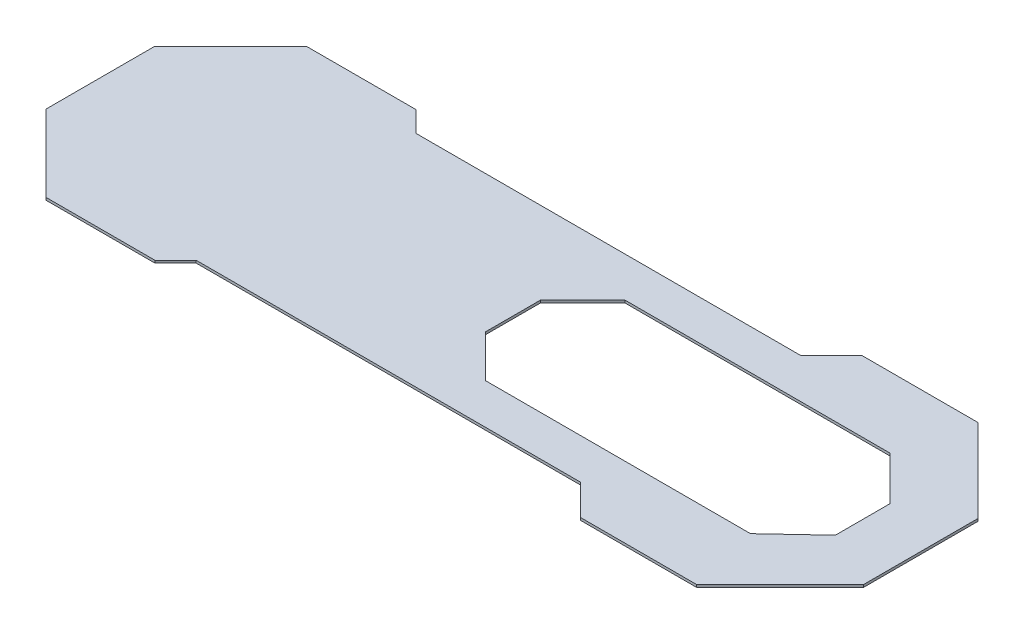
ISO-10303-21;
HEADER;
FILE_DESCRIPTION(('STEP AP214'),'2;1');
FILE_NAME('part.step','',(''),(''),'','','');
FILE_SCHEMA(('AUTOMOTIVE_DESIGN { 1 0 10303 214 1 1 1 1 }'));
ENDSEC;
DATA;
#1=APPLICATION_CONTEXT('core data for automotive mechanical design processes');
#2=APPLICATION_PROTOCOL_DEFINITION('international standard','automotive_design',2000,#1);
#3=PRODUCT_CONTEXT('',#1,'mechanical');
#4=PRODUCT('Part','Part','',(#3));
#5=PRODUCT_RELATED_PRODUCT_CATEGORY('part','',(#4));
#6=PRODUCT_DEFINITION_FORMATION('','',#4);
#7=PRODUCT_DEFINITION_CONTEXT('part definition',#1,'design');
#8=PRODUCT_DEFINITION('design','',#6,#7);
#9=PRODUCT_DEFINITION_SHAPE('','',#8);
#10=(LENGTH_UNIT() NAMED_UNIT(*) SI_UNIT(.MILLI.,.METRE.));
#11=(NAMED_UNIT(*) PLANE_ANGLE_UNIT() SI_UNIT($,.RADIAN.));
#12=(NAMED_UNIT(*) SI_UNIT($,.STERADIAN.) SOLID_ANGLE_UNIT());
#13=UNCERTAINTY_MEASURE_WITH_UNIT(LENGTH_MEASURE(1.E-05),#10,'distance_accuracy_value','');
#14=(GEOMETRIC_REPRESENTATION_CONTEXT(3) GLOBAL_UNCERTAINTY_ASSIGNED_CONTEXT((#13)) GLOBAL_UNIT_ASSIGNED_CONTEXT((#10,
#11,#12)) REPRESENTATION_CONTEXT('',''));
#15=CARTESIAN_POINT('',(0.,0.,0.));
#16=DIRECTION('',(0.,0.,1.));
#17=DIRECTION('',(1.,0.,0.));
#18=AXIS2_PLACEMENT_3D('',#15,#16,#17);
#19=CARTESIAN_POINT('',(-220.864567845436,-1.,153.389640506113));
#20=DIRECTION('',(0.707106781186546,0.,-0.707106781186549));
#21=DIRECTION('',(-0.707106781186549,0.,-0.707106781186546));
#22=AXIS2_PLACEMENT_3D('',#19,#20,#21);
#23=PLANE('',#22);
#24=DIRECTION('',(0.,-1.,0.));
#25=VECTOR('',#24,1.);
#26=CARTESIAN_POINT('',(-220.614567845437,-1.,153.639640506113));
#27=LINE('',#26,#25);
#28=CARTESIAN_POINT('',(-220.614567845436,0.,153.639640506113));
#29=VERTEX_POINT('',#28);
#30=CARTESIAN_POINT('',(-220.614567845436,-1.,153.639640506113));
#31=VERTEX_POINT('',#30);
#32=EDGE_CURVE('E268',#29,#31,#27,.T.);
#33=ORIENTED_EDGE('',*,*,#32,.F.);
#34=DIRECTION('',(-0.707106781186549,0.,-0.707106781186546));
#35=VECTOR('',#34,1.);
#36=CARTESIAN_POINT('',(-220.864567845436,0.,153.389640506113));
#37=LINE('',#36,#35);
#38=CARTESIAN_POINT('',(-212.364567845436,0.,161.889640506113));
#39=VERTEX_POINT('',#38);
#40=EDGE_CURVE('E349',#39,#29,#37,.T.);
#41=ORIENTED_EDGE('',*,*,#40,.F.);
#42=DIRECTION('',(0.,1.,0.));
#43=VECTOR('',#42,1.);
#44=CARTESIAN_POINT('',(-212.364567845436,-1.,161.889640506113));
#45=LINE('',#44,#43);
#46=CARTESIAN_POINT('',(-212.364567845436,-1.,161.889640506113));
#47=VERTEX_POINT('',#46);
#48=EDGE_CURVE('E378',#47,#39,#45,.T.);
#49=ORIENTED_EDGE('',*,*,#48,.F.);
#50=DIRECTION('',(-0.707106781186549,0.,-0.707106781186546));
#51=VECTOR('',#50,1.);
#52=CARTESIAN_POINT('',(-220.864567845436,-1.,153.389640506113));
#53=LINE('',#52,#51);
#54=EDGE_CURVE('E360',#47,#31,#53,.T.);
#55=ORIENTED_EDGE('',*,*,#54,.T.);
#56=EDGE_LOOP('',(#33,#41,#49,#55));
#57=FACE_BOUND('',#56,.T.);
#58=ADVANCED_FACE('F35',(#57),#23,.T.);
#59=CARTESIAN_POINT('',(-58.5138461441047,-1.,161.889640506113));
#60=DIRECTION('',(0.,0.,-1.));
#61=DIRECTION('',(-1.,0.,0.));
#62=AXIS2_PLACEMENT_3D('',#59,#60,#61);
#63=PLANE('',#62);
#64=DIRECTION('',(-1.,0.,0.));
#65=VECTOR('',#64,1.);
#66=CARTESIAN_POINT('',(-58.5138461441047,0.,161.889640506113));
#67=LINE('',#66,#65);
#68=CARTESIAN_POINT('',(-58.5138461441047,0.,161.889640506113));
#69=VERTEX_POINT('',#68);
#70=EDGE_CURVE('E373',#69,#39,#67,.T.);
#71=ORIENTED_EDGE('',*,*,#70,.F.);
#72=DIRECTION('',(0.,1.,0.));
#73=VECTOR('',#72,1.);
#74=CARTESIAN_POINT('',(-58.5138461441047,-1.,161.889640506113));
#75=LINE('',#74,#73);
#76=CARTESIAN_POINT('',(-58.5138461441047,-1.,161.889640506113));
#77=VERTEX_POINT('',#76);
#78=EDGE_CURVE('E380',#77,#69,#75,.T.);
#79=ORIENTED_EDGE('',*,*,#78,.F.);
#80=DIRECTION('',(-1.,0.,0.));
#81=VECTOR('',#80,1.);
#82=CARTESIAN_POINT('',(-58.5138461441047,-1.,161.889640506113));
#83=LINE('',#82,#81);
#84=EDGE_CURVE('E357',#77,#47,#83,.T.);
#85=ORIENTED_EDGE('',*,*,#84,.T.);
#86=ORIENTED_EDGE('',*,*,#48,.T.);
#87=EDGE_LOOP('',(#71,#79,#85,#86));
#88=FACE_BOUND('',#87,.T.);
#89=ADVANCED_FACE('F430',(#88),#63,.T.);
#90=CARTESIAN_POINT('',(-46.0138461441042,-1.,149.389640506113));
#91=DIRECTION('',(-0.707106781186542,0.,-0.707106781186553));
#92=DIRECTION('',(-0.707106781186553,0.,0.707106781186542));
#93=AXIS2_PLACEMENT_3D('',#90,#91,#92);
#94=PLANE('',#93);
#95=DIRECTION('',(0.,1.,0.));
#96=VECTOR('',#95,1.);
#97=CARTESIAN_POINT('',(-46.2638461441039,-1.,149.639640506113));
#98=LINE('',#97,#96);
#99=CARTESIAN_POINT('',(-46.2638461441039,-1.,149.639640506113));
#100=VERTEX_POINT('',#99);
#101=CARTESIAN_POINT('',(-46.2638461441039,0.,149.639640506113));
#102=VERTEX_POINT('',#101);
#103=EDGE_CURVE('E49',#100,#102,#98,.T.);
#104=ORIENTED_EDGE('',*,*,#103,.F.);
#105=DIRECTION('',(-0.707106781186553,0.,0.707106781186542));
#106=VECTOR('',#105,1.);
#107=CARTESIAN_POINT('',(-46.0138461441042,-1.,149.389640506113));
#108=LINE('',#107,#106);
#109=EDGE_CURVE('E355',#100,#77,#108,.T.);
#110=ORIENTED_EDGE('',*,*,#109,.T.);
#111=ORIENTED_EDGE('',*,*,#78,.T.);
#112=DIRECTION('',(-0.707106781186553,0.,0.707106781186542));
#113=VECTOR('',#112,1.);
#114=CARTESIAN_POINT('',(-46.0138461441042,0.,149.389640506113));
#115=LINE('',#114,#113);
#116=EDGE_CURVE('E371',#102,#69,#115,.T.);
#117=ORIENTED_EDGE('',*,*,#116,.F.);
#118=EDGE_LOOP('',(#104,#110,#111,#117));
#119=FACE_BOUND('',#118,.T.);
#120=ADVANCED_FACE('F424',(#119),#94,.T.);
#121=CARTESIAN_POINT('',(-46.0138461441041,-1.,262.389640506112));
#122=DIRECTION('',(-0.707106781186546,0.,0.707106781186549));
#123=DIRECTION('',(0.707106781186549,0.,0.707106781186546));
#124=AXIS2_PLACEMENT_3D('',#121,#122,#123);
#125=PLANE('',#124);
#126=DIRECTION('',(0.,-1.,0.));
#127=VECTOR('',#126,1.);
#128=CARTESIAN_POINT('',(-46.2638461441041,-1.,262.139640506112));
#129=LINE('',#128,#127);
#130=CARTESIAN_POINT('',(-46.2638461441041,0.,262.139640506112));
#131=VERTEX_POINT('',#130);
#132=CARTESIAN_POINT('',(-46.2638461441041,-1.,262.139640506112));
#133=VERTEX_POINT('',#132);
#134=EDGE_CURVE('E243',#131,#133,#129,.T.);
#135=ORIENTED_EDGE('',*,*,#134,.F.);
#136=DIRECTION('',(0.707106781186549,0.,0.707106781186546));
#137=VECTOR('',#136,1.);
#138=CARTESIAN_POINT('',(-46.0138461441041,0.,262.389640506112));
#139=LINE('',#138,#137);
#140=CARTESIAN_POINT('',(-58.513846144104,0.,249.889640506113));
#141=VERTEX_POINT('',#140);
#142=EDGE_CURVE('E368',#141,#131,#139,.T.);
#143=ORIENTED_EDGE('',*,*,#142,.F.);
#144=DIRECTION('',(0.,1.,0.));
#145=VECTOR('',#144,1.);
#146=CARTESIAN_POINT('',(-58.513846144104,-1.,249.889640506113));
#147=LINE('',#146,#145);
#148=CARTESIAN_POINT('',(-58.513846144104,-1.,249.889640506113));
#149=VERTEX_POINT('',#148);
#150=EDGE_CURVE('E383',#149,#141,#147,.T.);
#151=ORIENTED_EDGE('',*,*,#150,.F.);
#152=DIRECTION('',(0.707106781186549,0.,0.707106781186546));
#153=VECTOR('',#152,1.);
#154=CARTESIAN_POINT('',(-46.0138461441041,-1.,262.389640506112));
#155=LINE('',#154,#153);
#156=EDGE_CURVE('E352',#149,#133,#155,.T.);
#157=ORIENTED_EDGE('',*,*,#156,.T.);
#158=EDGE_LOOP('',(#135,#143,#151,#157));
#159=FACE_BOUND('',#158,.T.);
#160=ADVANCED_FACE('F412',(#159),#125,.T.);
#161=CARTESIAN_POINT('',(-212.364567845437,-1.,249.889640506113));
#162=DIRECTION('',(0.,0.,1.));
#163=DIRECTION('',(1.,0.,0.));
#164=AXIS2_PLACEMENT_3D('',#161,#162,#163);
#165=PLANE('',#164);
#166=DIRECTION('',(1.,0.,0.));
#167=VECTOR('',#166,1.);
#168=CARTESIAN_POINT('',(-212.364567845437,0.,249.889640506113));
#169=LINE('',#168,#167);
#170=CARTESIAN_POINT('',(-212.364567845437,0.,249.889640506113));
#171=VERTEX_POINT('',#170);
#172=EDGE_CURVE('E365',#171,#141,#169,.T.);
#173=ORIENTED_EDGE('',*,*,#172,.F.);
#174=DIRECTION('',(0.,1.,0.));
#175=VECTOR('',#174,1.);
#176=CARTESIAN_POINT('',(-212.364567845437,-1.,249.889640506113));
#177=LINE('',#176,#175);
#178=CARTESIAN_POINT('',(-212.364567845437,-1.,249.889640506113));
#179=VERTEX_POINT('',#178);
#180=EDGE_CURVE('E363',#179,#171,#177,.T.);
#181=ORIENTED_EDGE('',*,*,#180,.F.);
#182=DIRECTION('',(1.,0.,0.));
#183=VECTOR('',#182,1.);
#184=CARTESIAN_POINT('',(-212.364567845437,-1.,249.889640506113));
#185=LINE('',#184,#183);
#186=EDGE_CURVE('E348',#179,#149,#185,.T.);
#187=ORIENTED_EDGE('',*,*,#186,.T.);
#188=ORIENTED_EDGE('',*,*,#150,.T.);
#189=EDGE_LOOP('',(#173,#181,#187,#188));
#190=FACE_BOUND('',#189,.T.);
#191=ADVANCED_FACE('F408',(#190),#165,.T.);
#192=CARTESIAN_POINT('',(-220.864567845436,-1.,258.389640506113));
#193=DIRECTION('',(0.707106781186546,0.,0.707106781186549));
#194=DIRECTION('',(0.707106781186549,0.,-0.707106781186546));
#195=AXIS2_PLACEMENT_3D('',#192,#193,#194);
#196=PLANE('',#195);
#197=DIRECTION('',(0.,1.,0.));
#198=VECTOR('',#197,1.);
#199=CARTESIAN_POINT('',(-220.614567845437,-1.,258.139640506113));
#200=LINE('',#199,#198);
#201=CARTESIAN_POINT('',(-220.614567845437,-1.,258.139640506113));
#202=VERTEX_POINT('',#201);
#203=CARTESIAN_POINT('',(-220.614567845437,0.,258.139640506113));
#204=VERTEX_POINT('',#203);
#205=EDGE_CURVE('E273',#202,#204,#200,.T.);
#206=ORIENTED_EDGE('',*,*,#205,.F.);
#207=DIRECTION('',(0.707106781186549,0.,-0.707106781186546));
#208=VECTOR('',#207,1.);
#209=CARTESIAN_POINT('',(-220.864567845436,-1.,258.389640506113));
#210=LINE('',#209,#208);
#211=EDGE_CURVE('E346',#202,#179,#210,.T.);
#212=ORIENTED_EDGE('',*,*,#211,.T.);
#213=ORIENTED_EDGE('',*,*,#180,.T.);
#214=DIRECTION('',(0.707106781186549,0.,-0.707106781186546));
#215=VECTOR('',#214,1.);
#216=CARTESIAN_POINT('',(-220.864567845436,0.,258.389640506113));
#217=LINE('',#216,#215);
#218=EDGE_CURVE('E345',#204,#171,#217,.T.);
#219=ORIENTED_EDGE('',*,*,#218,.F.);
#220=EDGE_LOOP('',(#206,#212,#213,#219));
#221=FACE_BOUND('',#220,.T.);
#222=ADVANCED_FACE('F37',(#221),#196,.T.);
#223=CARTESIAN_POINT('',(0.,-1.,0.));
#224=DIRECTION('',(0.,1.,0.));
#225=DIRECTION('',(0.,0.,1.));
#226=AXIS2_PLACEMENT_3D('',#223,#224,#225);
#227=PLANE('',#226);
#228=DIRECTION('',(-0.707106781186548,0.,0.707106781186547));
#229=VECTOR('',#228,1.);
#230=CARTESIAN_POINT('',(131.157079978601,-1.,131.157079978601));
#231=LINE('',#230,#229);
#232=CARTESIAN_POINT('',(33.6392201299764,-0.999999999999999,228.674939827225));
#233=VERTEX_POINT('',#232);
#234=CARTESIAN_POINT('',(0.174519451089262,-0.999999999999999,262.139640506112));
#235=VERTEX_POINT('',#234);
#236=EDGE_CURVE('E237',#233,#235,#231,.T.);
#237=ORIENTED_EDGE('',*,*,#236,.T.);
#238=DIRECTION('',(-1.,0.,0.));
#239=VECTOR('',#238,1.);
#240=CARTESIAN_POINT('',(0.,-1.,262.139640506112));
#241=LINE('',#240,#239);
#242=EDGE_CURVE('E240',#235,#133,#241,.T.);
#243=ORIENTED_EDGE('',*,*,#242,.T.);
#244=ORIENTED_EDGE('',*,*,#156,.F.);
#245=ORIENTED_EDGE('',*,*,#186,.F.);
#246=ORIENTED_EDGE('',*,*,#211,.F.);
#247=DIRECTION('',(-1.,0.,0.));
#248=VECTOR('',#247,1.);
#249=CARTESIAN_POINT('',(0.,-1.,258.139640506113));
#250=LINE('',#249,#248);
#251=CARTESIAN_POINT('',(-264.253438504018,-0.999999999999999,258.139640506113));
#252=VERTEX_POINT('',#251);
#253=EDGE_CURVE('E270',#202,#252,#250,.T.);
#254=ORIENTED_EDGE('',*,*,#253,.T.);
#255=DIRECTION('',(-0.707106781186548,0.,-0.707106781186548));
#256=VECTOR('',#255,1.);
#257=CARTESIAN_POINT('',(-261.196539505066,-1.,261.196539505066));
#258=LINE('',#257,#256);
#259=CARTESIAN_POINT('',(-294.860779870024,-0.999999999999999,227.532299140107));
#260=VERTEX_POINT('',#259);
#261=EDGE_CURVE('E275',#252,#260,#258,.T.);
#262=ORIENTED_EDGE('',*,*,#261,.T.);
#263=DIRECTION('',(0.,0.,-1.));
#264=VECTOR('',#263,1.);
#265=CARTESIAN_POINT('',(-294.860779870024,-1.,0.));
#266=LINE('',#265,#264);
#267=CARTESIAN_POINT('',(-294.860779870024,-0.999999999999999,184.246981872119));
#268=VERTEX_POINT('',#267);
#269=EDGE_CURVE('E278',#260,#268,#266,.T.);
#270=ORIENTED_EDGE('',*,*,#269,.T.);
#271=DIRECTION('',(0.707106781186548,0.,-0.707106781186548));
#272=VECTOR('',#271,1.);
#273=CARTESIAN_POINT('',(-55.3068989989527,-1.,-55.3068989989527));
#274=LINE('',#273,#272);
#275=CARTESIAN_POINT('',(-264.253438504018,-0.999999999999999,153.639640506113));
#276=VERTEX_POINT('',#275);
#277=EDGE_CURVE('E257',#268,#276,#274,.T.);
#278=ORIENTED_EDGE('',*,*,#277,.T.);
#279=DIRECTION('',(1.,0.,0.));
#280=VECTOR('',#279,1.);
#281=CARTESIAN_POINT('',(0.,-1.,153.639640506113));
#282=LINE('',#281,#280);
#283=EDGE_CURVE('E265',#276,#31,#282,.T.);
#284=ORIENTED_EDGE('',*,*,#283,.T.);
#285=ORIENTED_EDGE('',*,*,#54,.F.);
#286=ORIENTED_EDGE('',*,*,#84,.F.);
#287=ORIENTED_EDGE('',*,*,#109,.F.);
#288=DIRECTION('',(1.,0.,0.));
#289=VECTOR('',#288,1.);
#290=CARTESIAN_POINT('',(0.,-1.,149.639640506113));
#291=LINE('',#290,#289);
#292=CARTESIAN_POINT('',(0.374519451089187,-0.999999999999999,149.639640506113));
#293=VERTEX_POINT('',#292);
#294=EDGE_CURVE('E227',#100,#293,#291,.T.);
#295=ORIENTED_EDGE('',*,*,#294,.T.);
#296=DIRECTION('',(0.707106781186548,0.,0.707106781186547));
#297=VECTOR('',#296,1.);
#298=CARTESIAN_POINT('',(-74.6325605275118,-1.,74.6325605275119));
#299=LINE('',#298,#297);
#300=CARTESIAN_POINT('',(33.6392201299764,-0.999999999999999,182.904341185));
#301=VERTEX_POINT('',#300);
#302=EDGE_CURVE('E204',#293,#301,#299,.T.);
#303=ORIENTED_EDGE('',*,*,#302,.T.);
#304=DIRECTION('',(0.,0.,1.));
#305=VECTOR('',#304,1.);
#306=CARTESIAN_POINT('',(33.6392201299764,-1.,0.));
#307=LINE('',#306,#305);
#308=EDGE_CURVE('E234',#301,#233,#307,.T.);
#309=ORIENTED_EDGE('',*,*,#308,.T.);
#310=EDGE_LOOP('',(#237,#243,#244,#245,#246,#254,#262,#270,#278,#284,#285,#286,#287,#295,#303,#309));
#311=FACE_BOUND('',#310,.T.);
#312=DIRECTION('',(-0.707106781186549,0.,-0.707106781186546));
#313=VECTOR('',#312,1.);
#314=CARTESIAN_POINT('',(-92.249699274949,-1.,92.2496992749494));
#315=LINE('',#314,#313);
#316=CARTESIAN_POINT('',(10.895241956214,-0.999999999999999,195.394640506112));
#317=VERTEX_POINT('',#316);
#318=CARTESIAN_POINT('',(-6.63291149814031,-0.999999999999999,177.866487051758));
#319=VERTEX_POINT('',#318);
#320=EDGE_CURVE('E339',#317,#319,#315,.T.);
#321=ORIENTED_EDGE('',*,*,#320,.T.);
#322=DIRECTION('',(-1.,0.,0.));
#323=VECTOR('',#322,1.);
#324=CARTESIAN_POINT('',(-3.72484235232924E-13,-1.,177.866487051758));
#325=LINE('',#324,#323);
#326=CARTESIAN_POINT('',(-112.662348749663,-0.999999999999999,177.866487051758));
#327=VERTEX_POINT('',#326);
#328=EDGE_CURVE('E342',#319,#327,#325,.T.);
#329=ORIENTED_EDGE('',*,*,#328,.T.);
#330=DIRECTION('',(-0.707106781186544,0.,0.707106781186551));
#331=VECTOR('',#330,1.);
#332=CARTESIAN_POINT('',(32.6020691510467,-1.,32.6020691510464));
#333=LINE('',#332,#331);
#334=CARTESIAN_POINT('',(-129.650630123902,-1.,194.854768425997));
#335=VERTEX_POINT('',#334);
#336=EDGE_CURVE('E307',#327,#335,#333,.T.);
#337=ORIENTED_EDGE('',*,*,#336,.T.);
#338=DIRECTION('',(0.,0.,1.));
#339=VECTOR('',#338,1.);
#340=CARTESIAN_POINT('',(-129.650630123903,-1.,4.93630996547507E-13));
#341=LINE('',#340,#339);
#342=CARTESIAN_POINT('',(-129.650630123902,-0.999999999999999,216.724512586227));
#343=VERTEX_POINT('',#342);
#344=EDGE_CURVE('E324',#335,#343,#341,.T.);
#345=ORIENTED_EDGE('',*,*,#344,.T.);
#346=DIRECTION('',(0.707106781186551,0.,0.707106781186544));
#347=VECTOR('',#346,1.);
#348=CARTESIAN_POINT('',(-173.187571355064,-1.,173.187571355066));
#349=LINE('',#348,#347);
#350=CARTESIAN_POINT('',(-112.662389705895,-0.999999999999999,233.712753004234));
#351=VERTEX_POINT('',#350);
#352=EDGE_CURVE('E327',#343,#351,#349,.T.);
#353=ORIENTED_EDGE('',*,*,#352,.T.);
#354=DIRECTION('',(1.,0.,0.));
#355=VECTOR('',#354,1.);
#356=CARTESIAN_POINT('',(9.78876645196436E-13,-1.,233.712753004234));
#357=LINE('',#356,#355);
#358=CARTESIAN_POINT('',(-6.6333897058949,-0.999999999999999,233.712753004234));
#359=VERTEX_POINT('',#358);
#360=EDGE_CURVE('E330',#351,#359,#357,.T.);
#361=ORIENTED_EDGE('',*,*,#360,.T.);
#362=DIRECTION('',(0.72923797083183,0.,-0.684260171204692));
#363=VECTOR('',#362,1.);
#364=CARTESIAN_POINT('',(113.514143224176,-1.,120.975656554397));
#365=LINE('',#364,#363);
#366=CARTESIAN_POINT('',(10.8952419562142,-0.999999999999999,217.265248922106));
#367=VERTEX_POINT('',#366);
#368=EDGE_CURVE('E333',#359,#367,#365,.T.);
#369=ORIENTED_EDGE('',*,*,#368,.T.);
#370=DIRECTION('',(0.,0.,-1.));
#371=VECTOR('',#370,1.);
#372=CARTESIAN_POINT('',(10.8952419562125,-1.,0.));
#373=LINE('',#372,#371);
#374=EDGE_CURVE('E336',#367,#317,#373,.T.);
#375=ORIENTED_EDGE('',*,*,#374,.T.);
#376=EDGE_LOOP('',(#321,#329,#337,#345,#353,#361,#369,#375));
#377=FACE_BOUND('',#376,.T.);
#378=ADVANCED_FACE('F399',(#311,#377),#227,.F.);
#379=CARTESIAN_POINT('',(0.,0.,0.));
#380=DIRECTION('',(0.,1.,0.));
#381=DIRECTION('',(0.,0.,1.));
#382=AXIS2_PLACEMENT_3D('',#379,#380,#381);
#383=PLANE('',#382);
#384=DIRECTION('',(-1.,0.,0.));
#385=VECTOR('',#384,1.);
#386=CARTESIAN_POINT('',(-50.1499885002021,0.,262.139640506112));
#387=LINE('',#386,#385);
#388=CARTESIAN_POINT('',(0.174519451089262,0.,262.139640506112));
#389=VERTEX_POINT('',#388);
#390=EDGE_CURVE('E207',#389,#131,#387,.T.);
#391=ORIENTED_EDGE('',*,*,#390,.F.);
#392=DIRECTION('',(-0.707106781186548,0.,0.707106781186547));
#393=VECTOR('',#392,1.);
#394=CARTESIAN_POINT('',(0.174519451089262,0.,262.139640506112));
#395=LINE('',#394,#393);
#396=CARTESIAN_POINT('',(33.6392201299764,0.,228.674939827225));
#397=VERTEX_POINT('',#396);
#398=EDGE_CURVE('E219',#397,#389,#395,.T.);
#399=ORIENTED_EDGE('',*,*,#398,.F.);
#400=DIRECTION('',(0.,0.,1.));
#401=VECTOR('',#400,1.);
#402=CARTESIAN_POINT('',(33.6392201299764,0.,182.904341185));
#403=LINE('',#402,#401);
#404=CARTESIAN_POINT('',(33.6392201299764,0.,182.904341185));
#405=VERTEX_POINT('',#404);
#406=EDGE_CURVE('E217',#405,#397,#403,.T.);
#407=ORIENTED_EDGE('',*,*,#406,.F.);
#408=DIRECTION('',(0.707106781186548,0.,0.707106781186547));
#409=VECTOR('',#408,1.);
#410=CARTESIAN_POINT('',(0.374519451089187,0.,149.639640506113));
#411=LINE('',#410,#409);
#412=CARTESIAN_POINT('',(0.374519451089187,0.,149.639640506113));
#413=VERTEX_POINT('',#412);
#414=EDGE_CURVE('E201',#413,#405,#411,.T.);
#415=ORIENTED_EDGE('',*,*,#414,.F.);
#416=DIRECTION('',(1.,0.,0.));
#417=VECTOR('',#416,1.);
#418=CARTESIAN_POINT('',(0.,0.,149.639640506113));
#419=LINE('',#418,#417);
#420=EDGE_CURVE('E11',#102,#413,#419,.T.);
#421=ORIENTED_EDGE('',*,*,#420,.F.);
#422=ORIENTED_EDGE('',*,*,#116,.T.);
#423=ORIENTED_EDGE('',*,*,#70,.T.);
#424=ORIENTED_EDGE('',*,*,#40,.T.);
#425=DIRECTION('',(1.,0.,0.));
#426=VECTOR('',#425,1.);
#427=CARTESIAN_POINT('',(-264.253438504018,0.,153.639640506113));
#428=LINE('',#427,#426);
#429=CARTESIAN_POINT('',(-264.253438504018,0.,153.639640506113));
#430=VERTEX_POINT('',#429);
#431=EDGE_CURVE('E249',#430,#29,#428,.T.);
#432=ORIENTED_EDGE('',*,*,#431,.F.);
#433=DIRECTION('',(0.707106781186547,0.,-0.707106781186547));
#434=VECTOR('',#433,1.);
#435=CARTESIAN_POINT('',(-294.860779870024,0.,184.246981872119));
#436=LINE('',#435,#434);
#437=CARTESIAN_POINT('',(-294.860779870024,0.,184.246981872119));
#438=VERTEX_POINT('',#437);
#439=EDGE_CURVE('E246',#438,#430,#436,.T.);
#440=ORIENTED_EDGE('',*,*,#439,.F.);
#441=DIRECTION('',(0.,0.,-1.));
#442=VECTOR('',#441,1.);
#443=CARTESIAN_POINT('',(-294.860779870024,0.,184.246981872119));
#444=LINE('',#443,#442);
#445=CARTESIAN_POINT('',(-294.860779870024,0.,227.532299140107));
#446=VERTEX_POINT('',#445);
#447=EDGE_CURVE('E57',#446,#438,#444,.T.);
#448=ORIENTED_EDGE('',*,*,#447,.F.);
#449=DIRECTION('',(-0.707106781186547,0.,-0.707106781186547));
#450=VECTOR('',#449,1.);
#451=CARTESIAN_POINT('',(-294.860779870024,0.,227.532299140107));
#452=LINE('',#451,#450);
#453=CARTESIAN_POINT('',(-264.253438504018,0.,258.139640506113));
#454=VERTEX_POINT('',#453);
#455=EDGE_CURVE('E251',#454,#446,#452,.T.);
#456=ORIENTED_EDGE('',*,*,#455,.F.);
#457=DIRECTION('',(-1.,0.,0.));
#458=VECTOR('',#457,1.);
#459=CARTESIAN_POINT('',(0.,0.,258.139640506113));
#460=LINE('',#459,#458);
#461=EDGE_CURVE('E43',#204,#454,#460,.T.);
#462=ORIENTED_EDGE('',*,*,#461,.F.);
#463=ORIENTED_EDGE('',*,*,#218,.T.);
#464=ORIENTED_EDGE('',*,*,#172,.T.);
#465=ORIENTED_EDGE('',*,*,#142,.T.);
#466=EDGE_LOOP('',(#391,#399,#407,#415,#421,#422,#423,#424,#432,#440,#448,#456,#462,#463,#464,#465));
#467=FACE_BOUND('',#466,.T.);
#468=DIRECTION('',(-1.,0.,0.));
#469=VECTOR('',#468,1.);
#470=CARTESIAN_POINT('',(-112.662348749663,0.,177.866487051758));
#471=LINE('',#470,#469);
#472=CARTESIAN_POINT('',(-6.63291149814031,0.,177.866487051758));
#473=VERTEX_POINT('',#472);
#474=CARTESIAN_POINT('',(-112.662348749663,0.,177.866487051758));
#475=VERTEX_POINT('',#474);
#476=EDGE_CURVE('E281',#473,#475,#471,.T.);
#477=ORIENTED_EDGE('',*,*,#476,.F.);
#478=DIRECTION('',(-0.707106781186549,0.,-0.707106781186546));
#479=VECTOR('',#478,1.);
#480=CARTESIAN_POINT('',(-6.63291149814031,0.,177.866487051758));
#481=LINE('',#480,#479);
#482=CARTESIAN_POINT('',(10.895241956214,0.,195.394640506112));
#483=VERTEX_POINT('',#482);
#484=EDGE_CURVE('E301',#483,#473,#481,.T.);
#485=ORIENTED_EDGE('',*,*,#484,.F.);
#486=DIRECTION('',(0.,0.,-1.));
#487=VECTOR('',#486,1.);
#488=CARTESIAN_POINT('',(10.895241956214,0.,195.394640506112));
#489=LINE('',#488,#487);
#490=CARTESIAN_POINT('',(10.8952419562142,0.,217.265248922106));
#491=VERTEX_POINT('',#490);
#492=EDGE_CURVE('E298',#491,#483,#489,.T.);
#493=ORIENTED_EDGE('',*,*,#492,.F.);
#494=DIRECTION('',(0.72923797083183,0.,-0.684260171204692));
#495=VECTOR('',#494,1.);
#496=CARTESIAN_POINT('',(10.8952419562142,0.,217.265248922106));
#497=LINE('',#496,#495);
#498=CARTESIAN_POINT('',(-6.6333897058949,0.,233.712753004234));
#499=VERTEX_POINT('',#498);
#500=EDGE_CURVE('E295',#499,#491,#497,.T.);
#501=ORIENTED_EDGE('',*,*,#500,.F.);
#502=DIRECTION('',(1.,0.,0.));
#503=VECTOR('',#502,1.);
#504=CARTESIAN_POINT('',(-6.6333897058949,0.,233.712753004234));
#505=LINE('',#504,#503);
#506=CARTESIAN_POINT('',(-112.662389705895,0.,233.712753004234));
#507=VERTEX_POINT('',#506);
#508=EDGE_CURVE('E292',#507,#499,#505,.T.);
#509=ORIENTED_EDGE('',*,*,#508,.F.);
#510=DIRECTION('',(0.707106781186551,0.,0.707106781186544));
#511=VECTOR('',#510,1.);
#512=CARTESIAN_POINT('',(-112.662389705895,0.,233.712753004234));
#513=LINE('',#512,#511);
#514=CARTESIAN_POINT('',(-129.650630123902,0.,216.724512586227));
#515=VERTEX_POINT('',#514);
#516=EDGE_CURVE('E289',#515,#507,#513,.T.);
#517=ORIENTED_EDGE('',*,*,#516,.F.);
#518=DIRECTION('',(0.,0.,1.));
#519=VECTOR('',#518,1.);
#520=CARTESIAN_POINT('',(-129.650630123902,0.,216.724512586227));
#521=LINE('',#520,#519);
#522=CARTESIAN_POINT('',(-129.650630123902,0.,194.854768425997));
#523=VERTEX_POINT('',#522);
#524=EDGE_CURVE('E286',#523,#515,#521,.T.);
#525=ORIENTED_EDGE('',*,*,#524,.F.);
#526=DIRECTION('',(-0.707106781186544,0.,0.707106781186551));
#527=VECTOR('',#526,1.);
#528=CARTESIAN_POINT('',(-129.650630123902,0.,194.854768425997));
#529=LINE('',#528,#527);
#530=EDGE_CURVE('E283',#475,#523,#529,.T.);
#531=ORIENTED_EDGE('',*,*,#530,.F.);
#532=EDGE_LOOP('',(#477,#485,#493,#501,#509,#517,#525,#531));
#533=FACE_BOUND('',#532,.T.);
#534=ADVANCED_FACE('F213',(#467,#533),#383,.T.);
#535=CARTESIAN_POINT('',(-112.662348749663,-10.,177.866487051758));
#536=DIRECTION('',(0.,0.,-1.));
#537=DIRECTION('',(-1.,0.,0.));
#538=AXIS2_PLACEMENT_3D('',#535,#536,#537);
#539=PLANE('',#538);
#540=DIRECTION('',(0.,1.,0.));
#541=VECTOR('',#540,1.);
#542=CARTESIAN_POINT('',(-6.63291149814031,-10.,177.866487051758));
#543=LINE('',#542,#541);
#544=EDGE_CURVE('E305',#319,#473,#543,.T.);
#545=ORIENTED_EDGE('',*,*,#544,.T.);
#546=ORIENTED_EDGE('',*,*,#476,.T.);
#547=DIRECTION('',(0.,1.,0.));
#548=VECTOR('',#547,1.);
#549=CARTESIAN_POINT('',(-112.662348749663,-10.,177.866487051758));
#550=LINE('',#549,#548);
#551=EDGE_CURVE('E304',#327,#475,#550,.T.);
#552=ORIENTED_EDGE('',*,*,#551,.F.);
#553=ORIENTED_EDGE('',*,*,#328,.F.);
#554=EDGE_LOOP('',(#545,#546,#552,#553));
#555=FACE_BOUND('',#554,.T.);
#556=ADVANCED_FACE('F475',(#555),#539,.F.);
#557=CARTESIAN_POINT('',(-6.63291149814031,-10.,177.866487051758));
#558=DIRECTION('',(0.707106781186546,0.,-0.707106781186549));
#559=DIRECTION('',(-0.707106781186549,0.,-0.707106781186546));
#560=AXIS2_PLACEMENT_3D('',#557,#558,#559);
#561=PLANE('',#560);
#562=DIRECTION('',(0.,1.,0.));
#563=VECTOR('',#562,1.);
#564=CARTESIAN_POINT('',(10.895241956214,-10.,195.394640506112));
#565=LINE('',#564,#563);
#566=EDGE_CURVE('E308',#317,#483,#565,.T.);
#567=ORIENTED_EDGE('',*,*,#566,.T.);
#568=ORIENTED_EDGE('',*,*,#484,.T.);
#569=ORIENTED_EDGE('',*,*,#544,.F.);
#570=ORIENTED_EDGE('',*,*,#320,.F.);
#571=EDGE_LOOP('',(#567,#568,#569,#570));
#572=FACE_BOUND('',#571,.T.);
#573=ADVANCED_FACE('F478',(#572),#561,.F.);
#574=CARTESIAN_POINT('',(10.895241956214,-10.,195.394640506112));
#575=DIRECTION('',(1.,0.,0.));
#576=DIRECTION('',(0.,0.,-1.));
#577=AXIS2_PLACEMENT_3D('',#574,#575,#576);
#578=PLANE('',#577);
#579=DIRECTION('',(0.,1.,0.));
#580=VECTOR('',#579,1.);
#581=CARTESIAN_POINT('',(10.8952419562142,-10.,217.265248922106));
#582=LINE('',#581,#580);
#583=EDGE_CURVE('E310',#367,#491,#582,.T.);
#584=ORIENTED_EDGE('',*,*,#583,.T.);
#585=ORIENTED_EDGE('',*,*,#492,.T.);
#586=ORIENTED_EDGE('',*,*,#566,.F.);
#587=ORIENTED_EDGE('',*,*,#374,.F.);
#588=EDGE_LOOP('',(#584,#585,#586,#587));
#589=FACE_BOUND('',#588,.T.);
#590=ADVANCED_FACE('F495',(#589),#578,.F.);
#591=CARTESIAN_POINT('',(10.8952419562142,-10.,217.265248922106));
#592=DIRECTION('',(0.684260171204692,0.,0.72923797083183));
#593=DIRECTION('',(0.72923797083183,0.,-0.684260171204692));
#594=AXIS2_PLACEMENT_3D('',#591,#592,#593);
#595=PLANE('',#594);
#596=DIRECTION('',(0.,1.,0.));
#597=VECTOR('',#596,1.);
#598=CARTESIAN_POINT('',(-6.6333897058949,-10.,233.712753004234));
#599=LINE('',#598,#597);
#600=EDGE_CURVE('E312',#359,#499,#599,.T.);
#601=ORIENTED_EDGE('',*,*,#600,.T.);
#602=ORIENTED_EDGE('',*,*,#500,.T.);
#603=ORIENTED_EDGE('',*,*,#583,.F.);
#604=ORIENTED_EDGE('',*,*,#368,.F.);
#605=EDGE_LOOP('',(#601,#602,#603,#604));
#606=FACE_BOUND('',#605,.T.);
#607=ADVANCED_FACE('F491',(#606),#595,.F.);
#608=CARTESIAN_POINT('',(-6.6333897058949,-10.,233.712753004234));
#609=DIRECTION('',(0.,0.,1.));
#610=DIRECTION('',(1.,0.,0.));
#611=AXIS2_PLACEMENT_3D('',#608,#609,#610);
#612=PLANE('',#611);
#613=DIRECTION('',(0.,1.,0.));
#614=VECTOR('',#613,1.);
#615=CARTESIAN_POINT('',(-112.662389705895,-10.,233.712753004234));
#616=LINE('',#615,#614);
#617=EDGE_CURVE('E314',#351,#507,#616,.T.);
#618=ORIENTED_EDGE('',*,*,#617,.T.);
#619=ORIENTED_EDGE('',*,*,#508,.T.);
#620=ORIENTED_EDGE('',*,*,#600,.F.);
#621=ORIENTED_EDGE('',*,*,#360,.F.);
#622=EDGE_LOOP('',(#618,#619,#620,#621));
#623=FACE_BOUND('',#622,.T.);
#624=ADVANCED_FACE('F487',(#623),#612,.F.);
#625=CARTESIAN_POINT('',(-112.662389705895,-10.,233.712753004234));
#626=DIRECTION('',(-0.707106781186544,0.,0.707106781186551));
#627=DIRECTION('',(0.707106781186551,0.,0.707106781186544));
#628=AXIS2_PLACEMENT_3D('',#625,#626,#627);
#629=PLANE('',#628);
#630=DIRECTION('',(0.,1.,0.));
#631=VECTOR('',#630,1.);
#632=CARTESIAN_POINT('',(-129.650630123902,-10.,216.724512586227));
#633=LINE('',#632,#631);
#634=EDGE_CURVE('E316',#343,#515,#633,.T.);
#635=ORIENTED_EDGE('',*,*,#634,.T.);
#636=ORIENTED_EDGE('',*,*,#516,.T.);
#637=ORIENTED_EDGE('',*,*,#617,.F.);
#638=ORIENTED_EDGE('',*,*,#352,.F.);
#639=EDGE_LOOP('',(#635,#636,#637,#638));
#640=FACE_BOUND('',#639,.T.);
#641=ADVANCED_FACE('F483',(#640),#629,.F.);
#642=CARTESIAN_POINT('',(-129.650630123902,-10.,216.724512586227));
#643=DIRECTION('',(-1.,0.,0.));
#644=DIRECTION('',(0.,0.,1.));
#645=AXIS2_PLACEMENT_3D('',#642,#643,#644);
#646=PLANE('',#645);
#647=DIRECTION('',(0.,1.,0.));
#648=VECTOR('',#647,1.);
#649=CARTESIAN_POINT('',(-129.650630123902,-10.,194.854768425997));
#650=LINE('',#649,#648);
#651=EDGE_CURVE('E318',#335,#523,#650,.T.);
#652=ORIENTED_EDGE('',*,*,#651,.T.);
#653=ORIENTED_EDGE('',*,*,#524,.T.);
#654=ORIENTED_EDGE('',*,*,#634,.F.);
#655=ORIENTED_EDGE('',*,*,#344,.F.);
#656=EDGE_LOOP('',(#652,#653,#654,#655));
#657=FACE_BOUND('',#656,.T.);
#658=ADVANCED_FACE('F448',(#657),#646,.F.);
#659=CARTESIAN_POINT('',(-129.650630123902,-10.,194.854768425997));
#660=DIRECTION('',(-0.707106781186551,0.,-0.707106781186544));
#661=DIRECTION('',(-0.707106781186544,0.,0.707106781186551));
#662=AXIS2_PLACEMENT_3D('',#659,#660,#661);
#663=PLANE('',#662);
#664=ORIENTED_EDGE('',*,*,#551,.T.);
#665=ORIENTED_EDGE('',*,*,#530,.T.);
#666=ORIENTED_EDGE('',*,*,#651,.F.);
#667=ORIENTED_EDGE('',*,*,#336,.F.);
#668=EDGE_LOOP('',(#664,#665,#666,#667));
#669=FACE_BOUND('',#668,.T.);
#670=ADVANCED_FACE('F441',(#669),#663,.F.);
#671=CARTESIAN_POINT('',(-294.860779870024,-10.,184.246981872119));
#672=DIRECTION('',(1.,0.,0.));
#673=DIRECTION('',(0.,0.,-1.));
#674=AXIS2_PLACEMENT_3D('',#671,#672,#673);
#675=PLANE('',#674);
#676=DIRECTION('',(0.,1.,0.));
#677=VECTOR('',#676,1.);
#678=CARTESIAN_POINT('',(-294.860779870024,-10.,227.532299140107));
#679=LINE('',#678,#677);
#680=EDGE_CURVE('E255',#260,#446,#679,.T.);
#681=ORIENTED_EDGE('',*,*,#680,.T.);
#682=ORIENTED_EDGE('',*,*,#447,.T.);
#683=DIRECTION('',(0.,1.,0.));
#684=VECTOR('',#683,1.);
#685=CARTESIAN_POINT('',(-294.860779870024,-10.,184.246981872119));
#686=LINE('',#685,#684);
#687=EDGE_CURVE('E254',#268,#438,#686,.T.);
#688=ORIENTED_EDGE('',*,*,#687,.F.);
#689=ORIENTED_EDGE('',*,*,#269,.F.);
#690=EDGE_LOOP('',(#681,#682,#688,#689));
#691=FACE_BOUND('',#690,.T.);
#692=ADVANCED_FACE('F439',(#691),#675,.F.);
#693=CARTESIAN_POINT('',(-294.860779870024,-10.,227.532299140107));
#694=DIRECTION('',(0.707106781186548,0.,-0.707106781186548));
#695=DIRECTION('',(-0.707106781186548,0.,-0.707106781186548));
#696=AXIS2_PLACEMENT_3D('',#693,#694,#695);
#697=PLANE('',#696);
#698=DIRECTION('',(0.,1.,0.));
#699=VECTOR('',#698,1.);
#700=CARTESIAN_POINT('',(-264.253438504018,-10.,258.139640506113));
#701=LINE('',#700,#699);
#702=EDGE_CURVE('E258',#252,#454,#701,.T.);
#703=ORIENTED_EDGE('',*,*,#702,.T.);
#704=ORIENTED_EDGE('',*,*,#455,.T.);
#705=ORIENTED_EDGE('',*,*,#680,.F.);
#706=ORIENTED_EDGE('',*,*,#261,.F.);
#707=EDGE_LOOP('',(#703,#704,#705,#706));
#708=FACE_BOUND('',#707,.T.);
#709=ADVANCED_FACE('F397',(#708),#697,.F.);
#710=CARTESIAN_POINT('',(-294.860779870024,-10.,184.246981872119));
#711=DIRECTION('',(0.707106781186548,0.,0.707106781186548));
#712=DIRECTION('',(0.707106781186548,0.,-0.707106781186548));
#713=AXIS2_PLACEMENT_3D('',#710,#711,#712);
#714=PLANE('',#713);
#715=ORIENTED_EDGE('',*,*,#687,.T.);
#716=ORIENTED_EDGE('',*,*,#439,.T.);
#717=DIRECTION('',(0.,1.,0.));
#718=VECTOR('',#717,1.);
#719=CARTESIAN_POINT('',(-264.253438504018,-10.,153.639640506113));
#720=LINE('',#719,#718);
#721=EDGE_CURVE('E260',#276,#430,#720,.T.);
#722=ORIENTED_EDGE('',*,*,#721,.F.);
#723=ORIENTED_EDGE('',*,*,#277,.F.);
#724=EDGE_LOOP('',(#715,#716,#722,#723));
#725=FACE_BOUND('',#724,.T.);
#726=ADVANCED_FACE('F438',(#725),#714,.F.);
#727=CARTESIAN_POINT('',(-264.253438504018,-10.,258.139640506113));
#728=DIRECTION('',(0.,0.,-1.));
#729=DIRECTION('',(-1.,0.,0.));
#730=AXIS2_PLACEMENT_3D('',#727,#728,#729);
#731=PLANE('',#730);
#732=ORIENTED_EDGE('',*,*,#205,.T.);
#733=ORIENTED_EDGE('',*,*,#461,.T.);
#734=ORIENTED_EDGE('',*,*,#702,.F.);
#735=ORIENTED_EDGE('',*,*,#253,.F.);
#736=EDGE_LOOP('',(#732,#733,#734,#735));
#737=FACE_BOUND('',#736,.T.);
#738=ADVANCED_FACE('F391',(#737),#731,.F.);
#739=CARTESIAN_POINT('',(-264.253438504018,-10.,153.639640506113));
#740=DIRECTION('',(0.,0.,1.));
#741=DIRECTION('',(1.,0.,0.));
#742=AXIS2_PLACEMENT_3D('',#739,#740,#741);
#743=PLANE('',#742);
#744=ORIENTED_EDGE('',*,*,#32,.T.);
#745=ORIENTED_EDGE('',*,*,#283,.F.);
#746=ORIENTED_EDGE('',*,*,#721,.T.);
#747=ORIENTED_EDGE('',*,*,#431,.T.);
#748=EDGE_LOOP('',(#744,#745,#746,#747));
#749=FACE_BOUND('',#748,.T.);
#750=ADVANCED_FACE('F435',(#749),#743,.F.);
#751=CARTESIAN_POINT('',(0.174519451089262,-10.,262.139640506112));
#752=DIRECTION('',(-0.707106781186547,0.,-0.707106781186548));
#753=DIRECTION('',(-0.707106781186548,0.,0.707106781186547));
#754=AXIS2_PLACEMENT_3D('',#751,#752,#753);
#755=PLANE('',#754);
#756=DIRECTION('',(0.,1.,0.));
#757=VECTOR('',#756,1.);
#758=CARTESIAN_POINT('',(33.6392201299764,-10.,228.674939827225));
#759=LINE('',#758,#757);
#760=EDGE_CURVE('E228',#233,#397,#759,.T.);
#761=ORIENTED_EDGE('',*,*,#760,.T.);
#762=ORIENTED_EDGE('',*,*,#398,.T.);
#763=DIRECTION('',(0.,1.,0.));
#764=VECTOR('',#763,1.);
#765=CARTESIAN_POINT('',(0.174519451089262,-10.,262.139640506112));
#766=LINE('',#765,#764);
#767=EDGE_CURVE('E225',#235,#389,#766,.T.);
#768=ORIENTED_EDGE('',*,*,#767,.F.);
#769=ORIENTED_EDGE('',*,*,#236,.F.);
#770=EDGE_LOOP('',(#761,#762,#768,#769));
#771=FACE_BOUND('',#770,.T.);
#772=ADVANCED_FACE('F418',(#771),#755,.F.);
#773=CARTESIAN_POINT('',(33.6392201299764,-10.,182.904341185));
#774=DIRECTION('',(-1.,0.,0.));
#775=DIRECTION('',(0.,0.,1.));
#776=AXIS2_PLACEMENT_3D('',#773,#774,#775);
#777=PLANE('',#776);
#778=DIRECTION('',(0.,1.,0.));
#779=VECTOR('',#778,1.);
#780=CARTESIAN_POINT('',(33.6392201299764,-10.,182.904341185));
#781=LINE('',#780,#779);
#782=EDGE_CURVE('E206',#301,#405,#781,.T.);
#783=ORIENTED_EDGE('',*,*,#782,.T.);
#784=ORIENTED_EDGE('',*,*,#406,.T.);
#785=ORIENTED_EDGE('',*,*,#760,.F.);
#786=ORIENTED_EDGE('',*,*,#308,.F.);
#787=EDGE_LOOP('',(#783,#784,#785,#786));
#788=FACE_BOUND('',#787,.T.);
#789=ADVANCED_FACE('F420',(#788),#777,.F.);
#790=CARTESIAN_POINT('',(0.374519451089187,-10.,149.639640506113));
#791=DIRECTION('',(-0.707106781186547,0.,0.707106781186548));
#792=DIRECTION('',(0.707106781186548,0.,0.707106781186547));
#793=AXIS2_PLACEMENT_3D('',#790,#791,#792);
#794=PLANE('',#793);
#795=DIRECTION('',(0.,1.,0.));
#796=VECTOR('',#795,1.);
#797=CARTESIAN_POINT('',(0.374519451089187,-10.,149.639640506113));
#798=LINE('',#797,#796);
#799=EDGE_CURVE('E197',#293,#413,#798,.T.);
#800=ORIENTED_EDGE('',*,*,#799,.T.);
#801=ORIENTED_EDGE('',*,*,#414,.T.);
#802=ORIENTED_EDGE('',*,*,#782,.F.);
#803=ORIENTED_EDGE('',*,*,#302,.F.);
#804=EDGE_LOOP('',(#800,#801,#802,#803));
#805=FACE_BOUND('',#804,.T.);
#806=ADVANCED_FACE('F198',(#805),#794,.F.);
#807=CARTESIAN_POINT('',(-50.1499885002021,-10.,262.139640506112));
#808=DIRECTION('',(0.,0.,-1.));
#809=DIRECTION('',(-1.,0.,0.));
#810=AXIS2_PLACEMENT_3D('',#807,#808,#809);
#811=PLANE('',#810);
#812=ORIENTED_EDGE('',*,*,#134,.T.);
#813=ORIENTED_EDGE('',*,*,#242,.F.);
#814=ORIENTED_EDGE('',*,*,#767,.T.);
#815=ORIENTED_EDGE('',*,*,#390,.T.);
#816=EDGE_LOOP('',(#812,#813,#814,#815));
#817=FACE_BOUND('',#816,.T.);
#818=ADVANCED_FACE('F414',(#817),#811,.F.);
#819=CARTESIAN_POINT('',(-47.5130227547605,-10.,149.639640506113));
#820=DIRECTION('',(0.,0.,1.));
#821=DIRECTION('',(1.,0.,0.));
#822=AXIS2_PLACEMENT_3D('',#819,#820,#821);
#823=PLANE('',#822);
#824=ORIENTED_EDGE('',*,*,#103,.T.);
#825=ORIENTED_EDGE('',*,*,#420,.T.);
#826=ORIENTED_EDGE('',*,*,#799,.F.);
#827=ORIENTED_EDGE('',*,*,#294,.F.);
#828=EDGE_LOOP('',(#824,#825,#826,#827));
#829=FACE_BOUND('',#828,.T.);
#830=ADVANCED_FACE('F209',(#829),#823,.F.);
#831=CLOSED_SHELL('',(#58,#89,#120,#160,#191,#222,#378,#534,#556,#573,#590,#607,#624,#641,#658,
#670,#692,#709,#726,#738,#750,#772,#789,#806,#818,#830));
#832=MANIFOLD_SOLID_BREP('B2',#831);
#833=ADVANCED_BREP_SHAPE_REPRESENTATION('',(#18,#832),#14);
#834=SHAPE_DEFINITION_REPRESENTATION(#9,#833);
ENDSEC;
END-ISO-10303-21;
